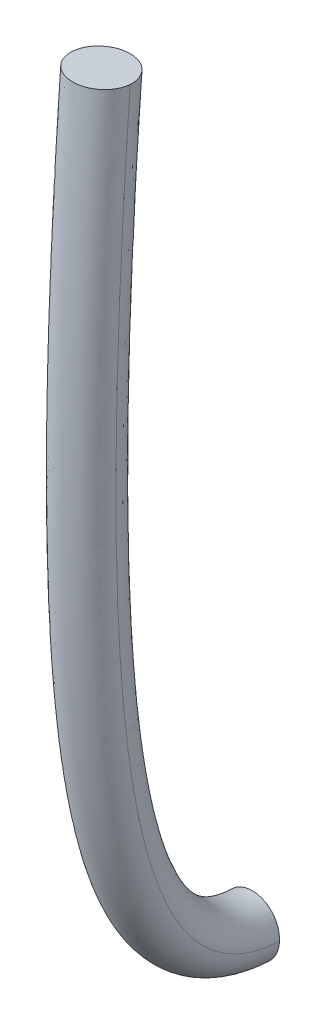
ISO-10303-21;
HEADER;
FILE_DESCRIPTION(('STEP AP214'),'2;1');
FILE_NAME('part.step','',(''),(''),'','','');
FILE_SCHEMA(('AUTOMOTIVE_DESIGN { 1 0 10303 214 1 1 1 1 }'));
ENDSEC;
DATA;
#1=APPLICATION_CONTEXT('core data for automotive mechanical design processes');
#2=APPLICATION_PROTOCOL_DEFINITION('international standard','automotive_design',2000,#1);
#3=PRODUCT_CONTEXT('',#1,'mechanical');
#4=PRODUCT('Part','Part','',(#3));
#5=PRODUCT_RELATED_PRODUCT_CATEGORY('part','',(#4));
#6=PRODUCT_DEFINITION_FORMATION('','',#4);
#7=PRODUCT_DEFINITION_CONTEXT('part definition',#1,'design');
#8=PRODUCT_DEFINITION('design','',#6,#7);
#9=PRODUCT_DEFINITION_SHAPE('','',#8);
#10=(LENGTH_UNIT() NAMED_UNIT(*) SI_UNIT(.MILLI.,.METRE.));
#11=(NAMED_UNIT(*) PLANE_ANGLE_UNIT() SI_UNIT($,.RADIAN.));
#12=(NAMED_UNIT(*) SI_UNIT($,.STERADIAN.) SOLID_ANGLE_UNIT());
#13=UNCERTAINTY_MEASURE_WITH_UNIT(LENGTH_MEASURE(1.E-05),#10,'distance_accuracy_value','');
#14=(GEOMETRIC_REPRESENTATION_CONTEXT(3) GLOBAL_UNCERTAINTY_ASSIGNED_CONTEXT((#13)) GLOBAL_UNIT_ASSIGNED_CONTEXT((#10,
#11,#12)) REPRESENTATION_CONTEXT('',''));
#15=CARTESIAN_POINT('',(0.,0.,0.));
#16=DIRECTION('',(0.,0.,1.));
#17=DIRECTION('',(1.,0.,0.));
#18=AXIS2_PLACEMENT_3D('',#15,#16,#17);
#19=CARTESIAN_POINT('',(23.9371057566579,-7.28816598042037,13.8273299080969));
#20=CARTESIAN_POINT('',(23.9371057566577,-7.27980001055594,13.9789788181656));
#21=CARTESIAN_POINT('',(23.9371057566575,-7.19253351591594,14.2453600131293));
#22=CARTESIAN_POINT('',(23.9371057566576,-6.82523242680181,14.5758258812968));
#23=CARTESIAN_POINT('',(23.937105756658,-6.16595469775204,14.8229200486194));
#24=CARTESIAN_POINT('',(23.9371057566585,-5.06044176763774,14.9938833322736));
#25=CARTESIAN_POINT('',(23.9371057566588,-3.3831178921434,15.0377936558768));
#26=CARTESIAN_POINT('',(23.9371057566583,-1.84086866513099,14.963481153656));
#27=CARTESIAN_POINT('',(23.9371057566579,-1.00711456130811,14.9025875739035));
#28=CARTESIAN_POINT('',(23.9662063156923,-7.22780146627857,13.8239997970796));
#29=CARTESIAN_POINT('',(23.9662063156921,-7.21998868504697,13.9656211246215));
#30=CARTESIAN_POINT('',(23.966206315692,-7.14067864682219,14.2083254480252));
#31=CARTESIAN_POINT('',(23.9662063156921,-6.79721161607877,14.5207579970228));
#32=CARTESIAN_POINT('',(23.9662063156924,-6.15278376686546,14.7636072340882));
#33=CARTESIAN_POINT('',(23.9662063156929,-5.0567535269108,14.9332999048969));
#34=CARTESIAN_POINT('',(23.9662063156932,-3.38442450644778,14.9773284055392));
#35=CARTESIAN_POINT('',(23.9662063156928,-1.84433198701564,14.9031167711318));
#36=CARTESIAN_POINT('',(23.9662063156923,-1.01151828298311,14.8422918738713));
#37=CARTESIAN_POINT('',(24.0827115569365,-7.13476005177365,13.8188670093165));
#38=CARTESIAN_POINT('',(24.0827115569363,-7.12779948254257,13.9450403944055));
#39=CARTESIAN_POINT('',(24.0827115569361,-7.0607589439193,14.1512539285629));
#40=CARTESIAN_POINT('',(24.0827115569362,-6.75401643570705,14.4358996344335));
#41=CARTESIAN_POINT('',(24.0827115569366,-6.13247531471433,14.6721996370838));
#42=CARTESIAN_POINT('',(24.0827115569371,-5.05106208153834,14.8399295627846));
#43=CARTESIAN_POINT('',(24.0827115569374,-3.38643221974463,14.8841366585997));
#44=CARTESIAN_POINT('',(24.0827115569369,-1.84967083091801,14.8100756131533));
#45=CARTESIAN_POINT('',(24.0827115569365,-1.0183058551114,14.7493565243648));
#46=CARTESIAN_POINT('',(24.3005977608246,-7.18477478125736,13.8216261568731));
#47=CARTESIAN_POINT('',(24.3005977608244,-7.17735687109576,13.9560897049392));
#48=CARTESIAN_POINT('',(24.3005977608242,-7.10371014503279,14.1819136596003));
#49=CARTESIAN_POINT('',(24.3005977608243,-6.77724676309787,14.4814813651153));
#50=CARTESIAN_POINT('',(24.3005977608247,-6.14340597286126,14.721313332256));
#51=CARTESIAN_POINT('',(24.3005977608252,-5.05413338525746,14.8901060131163));
#52=CARTESIAN_POINT('',(24.3005977608255,-3.38536400159648,14.9342234245588));
#53=CARTESIAN_POINT('',(24.300597760825,-1.84679961070105,14.860090109321));
#54=CARTESIAN_POINT('',(24.3005977608246,-1.01465717257935,14.7993142382471));
#55=CARTESIAN_POINT('',(24.3649999999986,-7.31847179552639,13.8290017798951));
#56=CARTESIAN_POINT('',(24.3649999999985,-7.30982729388697,13.9856996012998));
#57=CARTESIAN_POINT('',(24.3649999999983,-7.21857747007244,14.2639732769029));
#58=CARTESIAN_POINT('',(24.3649999999984,-6.83928907041965,14.6035083396044));
#59=CARTESIAN_POINT('',(24.3649999999987,-6.17255268520148,14.8527217163787));
#60=CARTESIAN_POINT('',(24.3649999999993,-5.06228102492084,15.024314866685));
#61=CARTESIAN_POINT('',(24.3649999999995,-3.3824503497317,15.0681592386526));
#62=CARTESIAN_POINT('',(24.3649999999991,-1.83913128396928,14.99378700265));
#63=CARTESIAN_POINT('',(24.3649999999986,-1.00490368664486,14.9328588411016));
#64=CARTESIAN_POINT('',(24.365,-7.38568943191456,13.8327099550486));
#65=CARTESIAN_POINT('',(24.3649999999998,-7.37642950308164,14.0005635497388));
#66=CARTESIAN_POINT('',(24.3649999999996,-7.27631209423688,14.3051981957616));
#67=CARTESIAN_POINT('',(24.3649999999998,-6.87049884776652,14.6648029308377));
#68=CARTESIAN_POINT('',(24.3650000000001,-6.18722901845414,14.9187515331597));
#69=CARTESIAN_POINT('',(24.3650000000006,-5.06639668854471,15.0917651838365));
#70=CARTESIAN_POINT('',(24.3650000000009,-3.38100350053056,15.135482603486));
#71=CARTESIAN_POINT('',(24.3650000000004,-1.83527381521949,15.0610044224056));
#72=CARTESIAN_POINT('',(24.365,-1.00000001490137,14.9999998509838));
#73=B_SPLINE_SURFACE_WITH_KNOTS('',3,3,((#19,#20,#21,#22,#23,#24,#25,#26,#27),(#28,#29,#30,#31,
#32,#33,#34,#35,#36),(#37,#38,#39,#40,#41,#42,#43,#44,#45),(#46,#47,#48,#49,#50,#51,#52,#53,
#54),(#55,#56,#57,#58,#59,#60,#61,#62,#63),(#64,#65,#66,#67,#68,#69,#70,#71,#72)),.UNSPECIFIED.,
.F.,.F.,.F.,(4,1,1,4),(4,1,1,1,1,1,4),(0.448798950512828,1.34639685153848,2.24399475256414,
3.14159265358979),(0.,0.142857142857143,0.285714285714286,0.428571428571429,0.571428571428571,
0.785714285714286,1.),.UNSPECIFIED.);
#74=CARTESIAN_POINT('',(24.365,-7.38568943191456,13.8327099550486));
#75=CARTESIAN_POINT('',(24.3649999999998,-7.37642950308164,14.0005635497388));
#76=CARTESIAN_POINT('',(24.3649999999996,-7.27631209423688,14.3051981957616));
#77=CARTESIAN_POINT('',(24.3649999999998,-6.87049884776652,14.6648029308377));
#78=CARTESIAN_POINT('',(24.3650000000001,-6.18722901845414,14.9187515331597));
#79=CARTESIAN_POINT('',(24.3650000000006,-5.06639668854471,15.0917651838365));
#80=CARTESIAN_POINT('',(24.3650000000009,-3.38100350053056,15.135482603486));
#81=CARTESIAN_POINT('',(24.3650000000004,-1.83527381521949,15.0610044224056));
#82=CARTESIAN_POINT('',(24.365,-1.00000001490137,14.9999998509838));
#83=B_SPLINE_CURVE_WITH_KNOTS('',3,(#74,#75,#76,#77,#78,#79,#80,#81,#82),.UNSPECIFIED.,.F.,.F.,
(4,1,1,1,1,1,4),(0.,0.142857142857143,0.285714285714286,0.428571428571429,0.571428571428571,
0.785714285714286,1.),.UNSPECIFIED.);
#84=CARTESIAN_POINT('',(24.365,-7.38568943191456,13.8327099550486));
#85=VERTEX_POINT('',#84);
#86=CARTESIAN_POINT('',(24.365,-1.00000001490137,14.9999998509838));
#87=VERTEX_POINT('',#86);
#88=EDGE_CURVE('E11',#85,#87,#83,.T.);
#89=CARTESIAN_POINT('',(24.365,-7.38568943191456,13.8327099550486));
#90=CARTESIAN_POINT('',(24.3650210716322,-7.41102272659417,13.8341075093057));
#91=CARTESIAN_POINT('',(24.3605249133442,-7.43642853346258,13.835509063821));
#92=CARTESIAN_POINT('',(24.3435792305505,-7.48436752822216,13.8381536999434));
#93=CARTESIAN_POINT('',(24.3311350500818,-7.50690263409342,13.8393968873592));
#94=CARTESIAN_POINT('',(24.2993187454389,-7.54639312424991,13.8415754473662));
#95=CARTESIAN_POINT('',(24.2799551474104,-7.56335532634351,13.8425111960734));
#96=CARTESIAN_POINT('',(24.236905112104,-7.58996509781772,13.8439791693423));
#97=CARTESIAN_POINT('',(24.213249247179,-7.59966205727214,13.8445141185914));
#98=CARTESIAN_POINT('',(24.1639873115756,-7.61052233561743,13.8451132443043));
#99=CARTESIAN_POINT('',(24.138376443554,-7.61166393320287,13.8451762224753));
#100=CARTESIAN_POINT('',(24.088108381035,-7.60564197804008,13.8448440110838));
#101=CARTESIAN_POINT('',(24.063452968507,-7.59846361238461,13.8444480043422));
#102=CARTESIAN_POINT('',(24.0179892021561,-7.57620566157354,13.8432201066563));
#103=CARTESIAN_POINT('',(23.9971861801515,-7.5611152348751,13.84238761762));
#104=CARTESIAN_POINT('',(23.9614896267063,-7.52495396137518,13.8403927195081));
#105=CARTESIAN_POINT('',(23.9466190727231,-7.50386039328439,13.839229056974));
#106=CARTESIAN_POINT('',(23.9254427697059,-7.45823219803949,13.8367119000342));
#107=CARTESIAN_POINT('',(23.9189686317427,-7.43377646865737,13.8353627581582));
#108=CARTESIAN_POINT('',(23.9152061010951,-7.39653133913045,13.8333080672865));
#109=CARTESIAN_POINT('',(23.9149618374304,-7.38393807647231,13.8326133385485));
#110=CARTESIAN_POINT('',(23.9164969401705,-7.35886360905451,13.8312300629372));
#111=CARTESIAN_POINT('',(23.9182752868302,-7.34638235102159,13.8305415131249));
#112=CARTESIAN_POINT('',(23.9239934554346,-7.32136310194367,13.8291612837271));
#113=CARTESIAN_POINT('',(23.928021093607,-7.30884482956093,13.8284706919552));
#114=CARTESIAN_POINT('',(23.9383328756027,-7.28477541059093,13.8271428615496));
#115=CARTESIAN_POINT('',(23.9446155929026,-7.27322365828373,13.8265055895005));
#116=CARTESIAN_POINT('',(23.9586108713988,-7.25221262458237,13.8253464801163));
#117=CARTESIAN_POINT('',(23.9661887348491,-7.24266272194398,13.8248196435063));
#118=CARTESIAN_POINT('',(23.9827545703797,-7.22485200721684,13.8238370851575));
#119=CARTESIAN_POINT('',(23.9917444379554,-7.21659295816012,13.8233814606794));
#120=CARTESIAN_POINT('',(24.0114965834184,-7.20109121687389,13.8225262807748));
#121=CARTESIAN_POINT('',(24.0223345651403,-7.19394445071618,13.8221320172731));
#122=CARTESIAN_POINT('',(24.0450447092242,-7.18156876943064,13.8214492917815));
#123=CARTESIAN_POINT('',(24.0569153683006,-7.17633712239187,13.821160679081));
#124=CARTESIAN_POINT('',(24.0813519056811,-7.16810625306779,13.8207066091857));
#125=CARTESIAN_POINT('',(24.0939140545689,-7.16509611592665,13.8205405498543));
#126=CARTESIAN_POINT('',(24.1193783631758,-7.16138950598181,13.820336068417));
#127=CARTESIAN_POINT('',(24.1322807318041,-7.16069448975353,13.8202977266656));
#128=CARTESIAN_POINT('',(24.1572957272613,-7.16144850977328,13.8203393234615));
#129=CARTESIAN_POINT('',(24.1694124486725,-7.1627807126356,13.8204128166966));
#130=CARTESIAN_POINT('',(24.1932988632092,-7.16730176845892,13.820662228425));
#131=CARTESIAN_POINT('',(24.2050683753647,-7.17049157227043,13.8208381993737));
#132=CARTESIAN_POINT('',(24.2288751876367,-7.17898746963107,13.8213068899911));
#133=CARTESIAN_POINT('',(24.2408605906323,-7.18444043521745,13.8216077121055));
#134=CARTESIAN_POINT('',(24.2636644454173,-7.1973631275889,13.8223206143934));
#135=CARTESIAN_POINT('',(24.2744845297719,-7.20482998018428,13.8227325360074));
#136=CARTESIAN_POINT('',(24.3035362846315,-7.22919220671322,13.8240765196397));
#137=CARTESIAN_POINT('',(24.3197517555425,-7.24855075506202,13.8251444668609));
#138=CARTESIAN_POINT('',(24.3453529038739,-7.29144694147371,13.8275109078901));
#139=CARTESIAN_POINT('',(24.3546949321832,-7.31501012705234,13.8288108110703));
#140=CARTESIAN_POINT('',(24.3632711375325,-7.35460740238868,13.8309952620632));
#141=CARTESIAN_POINT('',(24.3649870619843,-7.37013474867822,13.8318518545113));
#142=CARTESIAN_POINT('',(24.365,-7.38568943191456,13.8327099550486));
#143=B_SPLINE_CURVE_WITH_KNOTS('',3,(#89,#90,#91,#92,#93,#94,#95,#96,#97,#98,#99,#100,#101,#102,
#103,#104,#105,#106,#107,#108,#109,#110,#111,#112,#113,#114,#115,#116,#117,#118,#119,#120,#121,
#122,#123,#124,#125,#126,#127,#128,#129,#130,#131,#132,#133,#134,#135,#136,#137,#138,#139,#140,
#141,#142),.UNSPECIFIED.,.T.,.F.,(4,2,2,2,2,2,2,2,2,2,2,2,2,2,2,2,2,2,2,2,2,2,2,2,2,2,4),(0.,
0.0759426782156527,0.151834348288174,0.227632824861674,0.302911217626711,0.378380671015833,
0.453984697293712,0.529692592175982,0.605690934194756,0.680140290532414,0.717864012845789,
0.755568724310791,0.794860243320085,0.834126950882652,0.870580271246147,0.907082952051379,
0.945869577238464,0.984600655816107,1.02314014802298,1.06170388306096,1.0981277170735,
1.13457021176825,1.17388246233046,1.21313890123038,1.28747202616059,1.36227321538874,
1.4089021406313),.UNSPECIFIED.);
#144=CARTESIAN_POINT('',(23.9371057566579,-7.28816598042036,13.827329908097));
#145=VERTEX_POINT('',#144);
#146=EDGE_CURVE('E44',#145,#85,#143,.T.);
#147=CARTESIAN_POINT('',(23.9371057566579,-7.28816598042037,13.8273299080969));
#148=CARTESIAN_POINT('',(23.9371057566577,-7.27980001055594,13.9789788181656));
#149=CARTESIAN_POINT('',(23.9371057566575,-7.19253351591594,14.2453600131293));
#150=CARTESIAN_POINT('',(23.9371057566576,-6.82523242680181,14.5758258812968));
#151=CARTESIAN_POINT('',(23.937105756658,-6.16595469775204,14.8229200486194));
#152=CARTESIAN_POINT('',(23.9371057566585,-5.06044176763774,14.9938833322736));
#153=CARTESIAN_POINT('',(23.9371057566588,-3.3831178921434,15.0377936558768));
#154=CARTESIAN_POINT('',(23.9371057566583,-1.84086866513099,14.963481153656));
#155=CARTESIAN_POINT('',(23.9371057566579,-1.00711456130811,14.9025875739035));
#156=B_SPLINE_CURVE_WITH_KNOTS('',3,(#147,#148,#149,#150,#151,#152,#153,#154,#155),
.UNSPECIFIED.,.F.,.F.,(4,1,1,1,1,1,4),(0.,0.142857142857143,0.285714285714286,0.428571428571429,
0.571428571428571,0.785714285714286,1.),.UNSPECIFIED.);
#157=CARTESIAN_POINT('',(23.9371057566579,-1.0071145613081,14.9025875739035));
#158=VERTEX_POINT('',#157);
#159=EDGE_CURVE('E28',#145,#158,#156,.T.);
#160=CARTESIAN_POINT('',(24.365,-1.00000001490137,14.9999998509838));
#161=CARTESIAN_POINT('',(24.3649891433341,-1.0009250065414,14.9873348774511));
#162=CARTESIAN_POINT('',(24.3638488597262,-1.00185027110405,14.9746661670655));
#163=CARTESIAN_POINT('',(24.3594251987442,-1.00367475388395,14.9496853725175));
#164=CARTESIAN_POINT('',(24.356136753516,-1.00457390524362,14.9373742037682));
#165=CARTESIAN_POINT('',(24.3476068771094,-1.0063185419177,14.9134866610649));
#166=CARTESIAN_POINT('',(24.3423711430749,-1.00716417544498,14.9019082577823));
#167=CARTESIAN_POINT('',(24.3300899656184,-1.00878182260664,14.8797594538354));
#168=CARTESIAN_POINT('',(24.3230457883834,-1.009553887234,14.8691883549759));
#169=CARTESIAN_POINT('',(24.3070393184042,-1.0110246961969,14.849050057741));
#170=CARTESIAN_POINT('',(24.298024427566,-1.01172043333645,14.8395240338542));
#171=CARTESIAN_POINT('',(24.2783855945579,-1.01297810463971,14.8223040146894));
#172=CARTESIAN_POINT('',(24.2677627383159,-1.01354012845192,14.8146087919455));
#173=CARTESIAN_POINT('',(24.2461071078188,-1.01448310435711,14.8016975780877));
#174=CARTESIAN_POINT('',(24.2351543943105,-1.01487394040764,14.7963462559555));
#175=CARTESIAN_POINT('',(24.212531952076,-1.01552637882419,14.7874130776222));
#176=CARTESIAN_POINT('',(24.2008612619699,-1.01578780347744,14.7838336546622));
#177=CARTESIAN_POINT('',(24.1763775664475,-1.01618774218823,14.7783576990237));
#178=CARTESIAN_POINT('',(24.1635383176776,-1.01631777976576,14.7765772261997));
#179=CARTESIAN_POINT('',(24.1377544444002,-1.01641966454594,14.7751822211116));
#180=CARTESIAN_POINT('',(24.1248099940476,-1.01639173459349,14.7755646376583));
#181=CARTESIAN_POINT('',(24.0992345613548,-1.01616778131552,14.7786310030344));
#182=CARTESIAN_POINT('',(24.086602660881,-1.01597233130924,14.7813071019844));
#183=CARTESIAN_POINT('',(24.062029854464,-1.01541835211794,14.7888921778835));
#184=CARTESIAN_POINT('',(24.0500893621286,-1.01505972643267,14.7938024761127));
#185=CARTESIAN_POINT('',(24.0278421985115,-1.01422610823319,14.8052163656833));
#186=CARTESIAN_POINT('',(24.0174816904325,-1.0137586483081,14.8116168209119));
#187=CARTESIAN_POINT('',(23.9978714050922,-1.0127125352706,14.8259401870474));
#188=CARTESIAN_POINT('',(23.9886222703438,-1.01213381833551,14.8338639718132));
#189=CARTESIAN_POINT('',(23.970778319094,-1.010827812197,14.8517457909152));
#190=CARTESIAN_POINT('',(23.9622954724843,-1.01009232975607,14.861816006953));
#191=CARTESIAN_POINT('',(23.9472506771702,-1.00852566503814,14.8832667599422));
#192=CARTESIAN_POINT('',(23.9406859099397,-1.00769462570734,14.8946453396761));
#193=CARTESIAN_POINT('',(23.9249129718407,-1.00517442239608,14.929151930712));
#194=CARTESIAN_POINT('',(23.9186003292155,-1.00338311588273,14.953678476249));
#195=CARTESIAN_POINT('',(23.9151297509959,-1.00066655673509,14.9908735688488));
#196=CARTESIAN_POINT('',(23.9149841219811,-0.999752421936525,15.0033898906491));
#197=CARTESIAN_POINT('',(23.9166910716187,-0.997933152584979,15.0282993030038));
#198=CARTESIAN_POINT('',(23.9185423512273,-0.997028012567008,15.0406924683849));
#199=CARTESIAN_POINT('',(23.92439515842,-0.995208903449888,15.0655996868118));
#200=CARTESIAN_POINT('',(23.9284959847896,-0.994296609968493,15.0780907973213));
#201=CARTESIAN_POINT('',(23.9389347456926,-0.992542422034228,15.102109115755));
#202=CARTESIAN_POINT('',(23.9452723596639,-0.991700517515033,15.1136364615073));
#203=CARTESIAN_POINT('',(23.9594110042844,-0.990164444863985,15.1346683483134));
#204=CARTESIAN_POINT('',(23.9670893108125,-0.989464217216228,15.1442558561804));
#205=CARTESIAN_POINT('',(23.9838823559537,-0.9881617559761,15.1620891385795));
#206=CARTESIAN_POINT('',(23.9929976544293,-0.987559560764533,15.1703343876022));
#207=CARTESIAN_POINT('',(24.0128565547681,-0.986445028869454,15.1855945438474));
#208=CARTESIAN_POINT('',(24.0236535594165,-0.985937709982764,15.192540747461));
#209=CARTESIAN_POINT('',(24.0462930786492,-0.985067928182693,15.2044497885812));
#210=CARTESIAN_POINT('',(24.058135205297,-0.984705411794218,15.2094133582681));
#211=CARTESIAN_POINT('',(24.0822409598472,-0.984138133760146,15.2171805217495));
#212=CARTESIAN_POINT('',(24.094491194037,-0.983930325870192,15.2200258246822));
#213=CARTESIAN_POINT('',(24.1192950583377,-0.983662422300167,15.2236939568865));
#214=CARTESIAN_POINT('',(24.1318487891614,-0.983602376352453,15.2245161052234));
#215=CARTESIAN_POINT('',(24.1572506039772,-0.983633576997983,15.2240889063894));
#216=CARTESIAN_POINT('',(24.1700979397782,-0.983728760887322,15.2227856498116));
#217=CARTESIAN_POINT('',(24.1953589766216,-0.984082540401224,15.2179417052977));
#218=CARTESIAN_POINT('',(24.2077728013642,-0.984341089001713,15.2144016612147));
#219=CARTESIAN_POINT('',(24.2314446082626,-0.984998645865582,15.2053984011668));
#220=CARTESIAN_POINT('',(24.2427261145176,-0.98539319956276,15.1999961770646));
#221=CARTESIAN_POINT('',(24.2642606981147,-0.9863105706488,15.1874355440581));
#222=CARTESIAN_POINT('',(24.2745135823769,-0.986833412054982,15.180276806309));
#223=CARTESIAN_POINT('',(24.2939435792301,-0.988010399972079,15.1641615030204));
#224=CARTESIAN_POINT('',(24.3030868242103,-0.988667539607417,15.1551639556602));
#225=CARTESIAN_POINT('',(24.3196535422414,-0.990086759777795,15.1357320115029));
#226=CARTESIAN_POINT('',(24.3270771008128,-0.990848835091348,15.1252976861983));
#227=CARTESIAN_POINT('',(24.3461936597128,-0.993217625494059,15.0928642387415));
#228=CARTESIAN_POINT('',(24.3552934277872,-0.994942068586909,15.0692531862903));
#229=CARTESIAN_POINT('',(24.3634283663252,-0.997800245715498,15.0301190621328));
#230=CARTESIAN_POINT('',(24.3650129116573,-0.9988999372981,15.0150620992532));
#231=CARTESIAN_POINT('',(24.365,-1.00000001490137,14.9999998509838));
#232=B_SPLINE_CURVE_WITH_KNOTS('',3,(#160,#161,#162,#163,#164,#165,#166,#167,#168,#169,#170,
#171,#172,#173,#174,#175,#176,#177,#178,#179,#180,#181,#182,#183,#184,#185,#186,#187,#188,#189,
#190,#191,#192,#193,#194,#195,#196,#197,#198,#199,#200,#201,#202,#203,#204,#205,#206,#207,#208,
#209,#210,#211,#212,#213,#214,#215,#216,#217,#218,#219,#220,#221,#222,#223,#224,#225,#226,#227,
#228,#229,#230,#231),.UNSPECIFIED.,.T.,.F.,(4,2,2,2,2,2,2,2,2,2,2,2,2,2,2,2,2,2,2,2,2,2,2,2,2,2,
2,2,2,2,2,2,2,2,2,4),(0.,0.0380586584214441,0.0762074291004105,0.114245455590159,
0.152256921934151,0.191444331635145,0.230605393513614,0.267039360369367,0.303523221927323,
0.342234053670241,0.380890289653872,0.419414754722254,0.457962032393231,0.49437744948503,
0.530813818978828,0.570172432406538,0.609472915953184,0.683959549339644,0.721501589685301,
0.759019222626807,0.798344402542352,0.837663948910684,0.874413546288024,0.911177497122553,
0.949532776285878,0.987873877844044,1.02543847422995,1.06301571203403,1.10156097723337,
1.14009515233736,1.17747130549988,1.21485446136651,1.25318546918231,1.29151457037697,
1.36605851167617,1.41132105884724),.UNSPECIFIED.);
#233=EDGE_CURVE('E47',#87,#158,#232,.T.);
#234=ORIENTED_EDGE('',*,*,#88,.F.);
#235=ORIENTED_EDGE('',*,*,#146,.F.);
#236=ORIENTED_EDGE('',*,*,#159,.T.);
#237=ORIENTED_EDGE('',*,*,#233,.F.);
#238=EDGE_LOOP('',(#234,#235,#236,#237));
#239=FACE_BOUND('',#238,.T.);
#240=ADVANCED_FACE('F16',(#239),#73,.F.);
#241=CARTESIAN_POINT('',(24.14,-1.00000001490116,14.9999998509884));
#242=DIRECTION('',(5.3263280686712E-13,-0.997343536648528,0.0728414024124084));
#243=DIRECTION('',(0.,-0.0728414024124084,-0.997343536648528));
#244=AXIS2_PLACEMENT_3D('',#241,#242,#243);
#245=PLANE('',#244);
#246=ORIENTED_EDGE('',*,*,#233,.T.);
#247=EDGE_CURVE('E79',#158,#87,#232,.T.);
#248=ORIENTED_EDGE('',*,*,#247,.T.);
#249=EDGE_LOOP('',(#246,#248));
#250=FACE_BOUND('',#249,.T.);
#251=ADVANCED_FACE('F71',(#250),#245,.F.);
#252=CARTESIAN_POINT('',(24.14,-7.38568943191911,13.8327099550486));
#253=DIRECTION('',(1.11236968520861E-12,-0.0550829445172842,-0.998481782118886));
#254=DIRECTION('',(0.,0.998481782118886,-0.0550829445172842));
#255=AXIS2_PLACEMENT_3D('',#252,#253,#254);
#256=PLANE('',#255);
#257=EDGE_CURVE('E51',#85,#145,#143,.T.);
#258=ORIENTED_EDGE('',*,*,#257,.T.);
#259=ORIENTED_EDGE('',*,*,#146,.T.);
#260=EDGE_LOOP('',(#258,#259));
#261=FACE_BOUND('',#260,.T.);
#262=ADVANCED_FACE('F50',(#261),#256,.T.);
#263=CARTESIAN_POINT('',(24.365,-7.38568943191456,13.8327099550486));
#264=CARTESIAN_POINT('',(24.3649999999998,-7.37642950308164,14.0005635497388));
#265=CARTESIAN_POINT('',(24.3649999999996,-7.27631209423688,14.3051981957616));
#266=CARTESIAN_POINT('',(24.3649999999998,-6.87049884776652,14.6648029308377));
#267=CARTESIAN_POINT('',(24.3650000000001,-6.18722901845414,14.9187515331597));
#268=CARTESIAN_POINT('',(24.3650000000006,-5.06639668854471,15.0917651838365));
#269=CARTESIAN_POINT('',(24.3650000000009,-3.38100350053056,15.135482603486));
#270=CARTESIAN_POINT('',(24.3650000000004,-1.83527381521949,15.0610044224056));
#271=CARTESIAN_POINT('',(24.365,-1.00000001490137,14.9999998509838));
#272=CARTESIAN_POINT('',(24.365000000001,-7.43610265920569,13.8354910864138));
#273=CARTESIAN_POINT('',(24.3650000000008,-7.42638032085317,14.0117267217746));
#274=CARTESIAN_POINT('',(24.3650000000007,-7.31962387993988,14.3361379125797));
#275=CARTESIAN_POINT('',(24.3650000000008,-6.89389459520891,14.7108111842337));
#276=CARTESIAN_POINT('',(24.3650000000011,-6.19822122219088,14.9682987573142));
#277=CARTESIAN_POINT('',(24.3650000000017,-5.06947050018358,15.1423694035029));
#278=CARTESIAN_POINT('',(24.3650000000019,-3.37990631509653,15.185984708348));
#279=CARTESIAN_POINT('',(24.3650000000015,-1.83238214013707,15.1114175914059));
#280=CARTESIAN_POINT('',(24.365000000001,-0.996322261093759,15.0503556083956));
#281=CARTESIAN_POINT('',(24.3414547118067,-7.50309625126707,13.8391869017813));
#282=CARTESIAN_POINT('',(24.3414547118065,-7.49275978961236,14.0265546749496));
#283=CARTESIAN_POINT('',(24.3414547118063,-7.37717570289441,14.3772441530626));
#284=CARTESIAN_POINT('',(24.3414547118065,-6.924990027523,14.7719347049894));
#285=CARTESIAN_POINT('',(24.3414547118068,-6.2128352359791,15.0341306328767));
#286=CARTESIAN_POINT('',(24.3414547118073,-5.0735609237704,15.2096095809617));
#287=CARTESIAN_POINT('',(24.3414547118076,-3.37845355689978,15.2530922103668));
#288=CARTESIAN_POINT('',(24.3414547118072,-1.8285387993388,15.178411060352));
#289=CARTESIAN_POINT('',(24.3414547118067,-0.991434933867791,15.1172728293563));
#290=CARTESIAN_POINT('',(24.2694782238678,-7.57470854835477,13.8431375158614));
#291=CARTESIAN_POINT('',(24.2694782238676,-7.56371634060432,14.0423919181134));
#292=CARTESIAN_POINT('',(24.2694782238674,-7.43868605638419,14.4211664078949));
#293=CARTESIAN_POINT('',(24.2694782238675,-6.95823914744309,14.8372403803515));
#294=CARTESIAN_POINT('',(24.2694782238679,-6.22846962183694,15.1044798964719));
#295=CARTESIAN_POINT('',(24.2694782238684,-5.07794439541717,15.2814713924503));
#296=CARTESIAN_POINT('',(24.2694782238687,-3.37691092827516,15.3248180907432));
#297=CARTESIAN_POINT('',(24.2694782238682,-1.82442927121153,15.2500231368908));
#298=CARTESIAN_POINT('',(24.2694782238678,-0.986210662135228,15.1888034901295));
#299=CARTESIAN_POINT('',(24.1761630010184,-7.61993752761154,13.8456326493726));
#300=CARTESIAN_POINT('',(24.1761630010183,-7.60853024329051,14.0524110937316));
#301=CARTESIAN_POINT('',(24.1761630010181,-7.4775466941733,14.4489299237528));
#302=CARTESIAN_POINT('',(24.1761630010182,-6.97922596818649,14.8785271075427));
#303=CARTESIAN_POINT('',(24.1761630010186,-6.23832751517819,15.1489384156961));
#304=CARTESIAN_POINT('',(24.1761630010191,-5.08069873574475,15.3268760242801));
#305=CARTESIAN_POINT('',(24.1761630010194,-3.37592342793315,15.3701293080552));
#306=CARTESIAN_POINT('',(24.1761630010189,-1.82183533399334,15.2952520910376));
#307=CARTESIAN_POINT('',(24.1761630010184,-0.982911110418115,15.2339809094262));
#308=CARTESIAN_POINT('',(24.0349450454953,-7.60399896586506,13.8447533715247));
#309=CARTESIAN_POINT('',(24.0349450454951,-7.59273816459856,14.0488765355134));
#310=CARTESIAN_POINT('',(24.0349450454949,-7.46384959400253,14.4391408466929));
#311=CARTESIAN_POINT('',(24.034945045495,-6.97183319006584,14.8639683903947));
#312=CARTESIAN_POINT('',(24.0349450454954,-6.23485741024806,15.1332651023645));
#313=CARTESIAN_POINT('',(24.0349450454959,-5.07973137112111,15.3108714133975));
#314=CARTESIAN_POINT('',(24.0349450454962,-3.37627445370131,15.3541593535566));
#315=CARTESIAN_POINT('',(24.0349450454957,-1.82274907083284,15.2793135119092));
#316=CARTESIAN_POINT('',(24.0349450454953,-0.984073862919882,15.2180605172608));
#317=CARTESIAN_POINT('',(23.9080953270916,-7.47839505636668,13.8378242183823));
#318=CARTESIAN_POINT('',(23.9080953270914,-7.46828542315497,14.021080300175));
#319=CARTESIAN_POINT('',(23.9080953270912,-7.35595068679778,14.3620779765681));
#320=CARTESIAN_POINT('',(23.9080953270913,-6.91353029223026,14.7493802932642));
#321=CARTESIAN_POINT('',(23.9080953270917,-6.20745399110942,15.0098460666307));
#322=CARTESIAN_POINT('',(23.9080953270922,-5.07205883620804,15.1848097061202));
#323=CARTESIAN_POINT('',(23.9080953270925,-3.37899487690843,15.228344503824));
#324=CARTESIAN_POINT('',(23.908095327092,-1.82995520506464,15.1537098617841));
#325=CARTESIAN_POINT('',(23.9080953270916,-0.993236939382819,15.0925997932303));
#326=CARTESIAN_POINT('',(23.9080051976234,-7.34853049456217,13.8306600191143));
#327=CARTESIAN_POINT('',(23.9080051976232,-7.33961133606492,13.9923365117097));
#328=CARTESIAN_POINT('',(23.9080051976231,-7.24438838500968,14.2823945782334));
#329=CARTESIAN_POINT('',(23.9080051976232,-6.85325323752486,14.6308937655708));
#330=CARTESIAN_POINT('',(23.9080051976235,-6.17912562863863,14.8822328631505));
#331=CARTESIAN_POINT('',(23.908005197624,-5.06413000836467,15.0544667596502));
#332=CARTESIAN_POINT('',(23.9080051976243,-3.38181127783902,15.0982589062144));
#333=CARTESIAN_POINT('',(23.9080051976239,-1.83740534324634,15.0238455361803));
#334=CARTESIAN_POINT('',(23.9080051976234,-1.0027108396331,14.9628832739358));
#335=CARTESIAN_POINT('',(23.9371057566579,-7.28816598042037,13.8273299080969));
#336=CARTESIAN_POINT('',(23.9371057566577,-7.27980001055594,13.9789788181656));
#337=CARTESIAN_POINT('',(23.9371057566575,-7.19253351591594,14.2453600131293));
#338=CARTESIAN_POINT('',(23.9371057566576,-6.82523242680181,14.5758258812968));
#339=CARTESIAN_POINT('',(23.937105756658,-6.16595469775204,14.8229200486194));
#340=CARTESIAN_POINT('',(23.9371057566585,-5.06044176763774,14.9938833322736));
#341=CARTESIAN_POINT('',(23.9371057566588,-3.3831178921434,15.0377936558768));
#342=CARTESIAN_POINT('',(23.9371057566583,-1.84086866513099,14.963481153656));
#343=CARTESIAN_POINT('',(23.9371057566579,-1.00711456130811,14.9025875739035));
#344=B_SPLINE_SURFACE_WITH_KNOTS('',3,3,((#263,#264,#265,#266,#267,#268,#269,#270,#271),(#272,
#273,#274,#275,#276,#277,#278,#279,#280),(#281,#282,#283,#284,#285,#286,#287,#288,#289),(#290,
#291,#292,#293,#294,#295,#296,#297,#298),(#299,#300,#301,#302,#303,#304,#305,#306,#307),(#308,
#309,#310,#311,#312,#313,#314,#315,#316),(#317,#318,#319,#320,#321,#322,#323,#324,#325),(#326,
#327,#328,#329,#330,#331,#332,#333,#334),(#335,#336,#337,#338,#339,#340,#341,#342,#343)),
.UNSPECIFIED.,.F.,.F.,.F.,(4,1,1,1,1,1,4),(4,1,1,1,1,1,4),(-3.14159265358979,-2.46839422782055,
-2.24399475256414,-1.79519580205131,-1.12199737628207,-0.448798950512828,0.448798950512828),(0.,
0.142857142857143,0.285714285714286,0.428571428571429,0.571428571428571,0.785714285714286,1.),.UNSPECIFIED.);
#345=ORIENTED_EDGE('',*,*,#257,.F.);
#346=ORIENTED_EDGE('',*,*,#88,.T.);
#347=ORIENTED_EDGE('',*,*,#247,.F.);
#348=ORIENTED_EDGE('',*,*,#159,.F.);
#349=EDGE_LOOP('',(#345,#346,#347,#348));
#350=FACE_BOUND('',#349,.T.);
#351=ADVANCED_FACE('F53',(#350),#344,.F.);
#352=CLOSED_SHELL('',(#240,#251,#262,#351));
#353=MANIFOLD_SOLID_BREP('B1',#352);
#354=ADVANCED_BREP_SHAPE_REPRESENTATION('',(#18,#353),#14);
#355=SHAPE_DEFINITION_REPRESENTATION(#9,#354);
ENDSEC;
END-ISO-10303-21;
